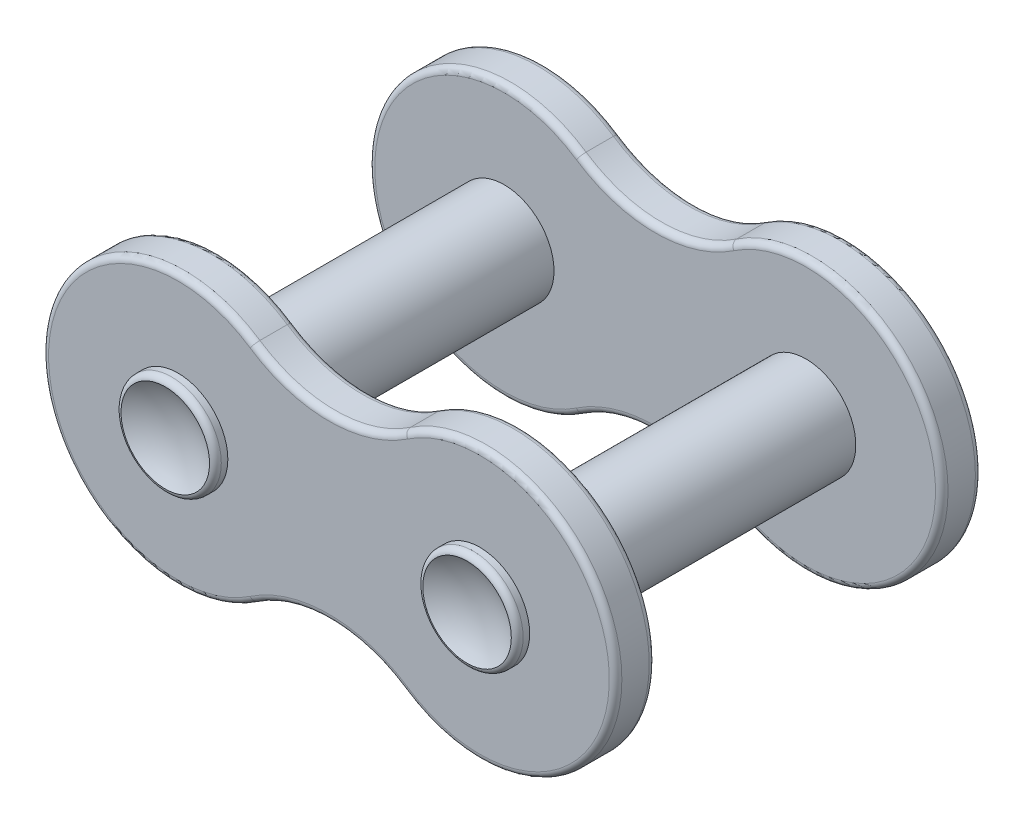
ISO-10303-21;
HEADER;
FILE_DESCRIPTION(('STEP AP214'),'2;1');
FILE_NAME('part.step','',(''),(''),'','','');
FILE_SCHEMA(('AUTOMOTIVE_DESIGN { 1 0 10303 214 1 1 1 1 }'));
ENDSEC;
DATA;
#1=APPLICATION_CONTEXT('core data for automotive mechanical design processes');
#2=APPLICATION_PROTOCOL_DEFINITION('international standard','automotive_design',2000,#1);
#3=PRODUCT_CONTEXT('',#1,'mechanical');
#4=PRODUCT('Part','Part','',(#3));
#5=PRODUCT_RELATED_PRODUCT_CATEGORY('part','',(#4));
#6=PRODUCT_DEFINITION_FORMATION('','',#4);
#7=PRODUCT_DEFINITION_CONTEXT('part definition',#1,'design');
#8=PRODUCT_DEFINITION('design','',#6,#7);
#9=PRODUCT_DEFINITION_SHAPE('','',#8);
#10=(LENGTH_UNIT() NAMED_UNIT(*) SI_UNIT(.MILLI.,.METRE.));
#11=(NAMED_UNIT(*) PLANE_ANGLE_UNIT() SI_UNIT($,.RADIAN.));
#12=(NAMED_UNIT(*) SI_UNIT($,.STERADIAN.) SOLID_ANGLE_UNIT());
#13=UNCERTAINTY_MEASURE_WITH_UNIT(LENGTH_MEASURE(1.E-05),#10,'distance_accuracy_value','');
#14=(GEOMETRIC_REPRESENTATION_CONTEXT(3) GLOBAL_UNCERTAINTY_ASSIGNED_CONTEXT((#13)) GLOBAL_UNIT_ASSIGNED_CONTEXT((#10,
#11,#12)) REPRESENTATION_CONTEXT('',''));
#15=CARTESIAN_POINT('',(0.,0.,0.));
#16=DIRECTION('',(0.,0.,1.));
#17=DIRECTION('',(1.,0.,0.));
#18=AXIS2_PLACEMENT_3D('',#15,#16,#17);
#19=CARTESIAN_POINT('',(3.,4.47214776638019,1.5875));
#20=DIRECTION('',(0.,0.,1.));
#21=DIRECTION('',(1.,0.,0.));
#22=AXIS2_PLACEMENT_3D('',#19,#20,#21);
#23=PLANE('',#22);
#24=CARTESIAN_POINT('',(0.,-8.94429553276038,1.5875));
#25=DIRECTION('',(0.,0.,1.));
#26=DIRECTION('',(1.,0.,0.));
#27=AXIS2_PLACEMENT_3D('',#24,#25,#26);
#28=CIRCLE('',#27,5.62284923191246);
#29=CARTESIAN_POINT('',(-3.13240496338893,-4.2747695792877,1.5875));
#30=VERTEX_POINT('',#29);
#31=CARTESIAN_POINT('',(3.13240496338893,-4.2747695792877,1.5875));
#32=VERTEX_POINT('',#31);
#33=EDGE_CURVE('E401',#30,#32,#28,.F.);
#34=ORIENTED_EDGE('',*,*,#33,.T.);
#35=CARTESIAN_POINT('',(6.,0.,1.5875));
#36=DIRECTION('',(0.,0.,1.));
#37=DIRECTION('',(1.,0.,0.));
#38=AXIS2_PLACEMENT_3D('',#35,#36,#37);
#39=CIRCLE('',#38,5.1475);
#40=CARTESIAN_POINT('',(3.13240496338893,4.2747695792877,1.5875));
#41=VERTEX_POINT('',#40);
#42=EDGE_CURVE('E403',#32,#41,#39,.T.);
#43=ORIENTED_EDGE('',*,*,#42,.T.);
#44=CARTESIAN_POINT('',(0.,8.94429553276038,1.5875));
#45=DIRECTION('',(0.,0.,1.));
#46=DIRECTION('',(1.,0.,0.));
#47=AXIS2_PLACEMENT_3D('',#44,#45,#46);
#48=CIRCLE('',#47,5.62284923191246);
#49=CARTESIAN_POINT('',(-3.13240496338893,4.2747695792877,1.5875));
#50=VERTEX_POINT('',#49);
#51=EDGE_CURVE('E184',#41,#50,#48,.F.);
#52=ORIENTED_EDGE('',*,*,#51,.T.);
#53=CARTESIAN_POINT('',(-6.,0.,1.5875));
#54=DIRECTION('',(0.,0.,1.));
#55=DIRECTION('',(1.,0.,0.));
#56=AXIS2_PLACEMENT_3D('',#53,#54,#55);
#57=CIRCLE('',#56,5.1475);
#58=EDGE_CURVE('E399',#50,#30,#57,.T.);
#59=ORIENTED_EDGE('',*,*,#58,.T.);
#60=EDGE_LOOP('',(#34,#43,#52,#59));
#61=FACE_BOUND('',#60,.T.);
#62=CARTESIAN_POINT('',(-6.,0.,1.5875));
#63=DIRECTION('',(0.,0.,1.));
#64=DIRECTION('',(1.,0.,0.));
#65=AXIS2_PLACEMENT_3D('',#62,#63,#64);
#66=CIRCLE('',#65,1.98);
#67=CARTESIAN_POINT('',(-4.02,0.,1.5875));
#68=VERTEX_POINT('',#67);
#69=EDGE_CURVE('E171',#68,#68,#66,.T.);
#70=ORIENTED_EDGE('',*,*,#69,.F.);
#71=EDGE_LOOP('',(#70));
#72=FACE_BOUND('',#71,.T.);
#73=CARTESIAN_POINT('',(6.,0.,1.5875));
#74=DIRECTION('',(0.,0.,1.));
#75=DIRECTION('',(-1.,0.,0.));
#76=AXIS2_PLACEMENT_3D('',#73,#74,#75);
#77=CIRCLE('',#76,1.98);
#78=CARTESIAN_POINT('',(4.02,0.,1.5875));
#79=VERTEX_POINT('',#78);
#80=EDGE_CURVE('E348',#79,#79,#77,.T.);
#81=ORIENTED_EDGE('',*,*,#80,.F.);
#82=EDGE_LOOP('',(#81));
#83=FACE_BOUND('',#82,.T.);
#84=ADVANCED_FACE('F33',(#61,#72,#83),#23,.T.);
#85=CARTESIAN_POINT('',(3.,4.47214776638019,0.));
#86=DIRECTION('',(0.,0.,1.));
#87=DIRECTION('',(1.,0.,0.));
#88=AXIS2_PLACEMENT_3D('',#85,#86,#87);
#89=PLANE('',#88);
#90=CARTESIAN_POINT('',(0.,8.94429553276038,0.));
#91=DIRECTION('',(0.,0.,1.));
#92=DIRECTION('',(1.,0.,0.));
#93=AXIS2_PLACEMENT_3D('',#90,#91,#92);
#94=CIRCLE('',#93,5.62284923191246);
#95=CARTESIAN_POINT('',(-3.13240496338893,4.2747695792877,0.));
#96=VERTEX_POINT('',#95);
#97=CARTESIAN_POINT('',(3.13240496338893,4.2747695792877,0.));
#98=VERTEX_POINT('',#97);
#99=EDGE_CURVE('E381',#96,#98,#94,.T.);
#100=ORIENTED_EDGE('',*,*,#99,.T.);
#101=CARTESIAN_POINT('',(6.,0.,0.));
#102=DIRECTION('',(0.,0.,1.));
#103=DIRECTION('',(1.,0.,0.));
#104=AXIS2_PLACEMENT_3D('',#101,#102,#103);
#105=CIRCLE('',#104,5.1475);
#106=CARTESIAN_POINT('',(3.13240496338893,-4.2747695792877,0.));
#107=VERTEX_POINT('',#106);
#108=EDGE_CURVE('E387',#98,#107,#105,.F.);
#109=ORIENTED_EDGE('',*,*,#108,.T.);
#110=CARTESIAN_POINT('',(0.,-8.94429553276038,0.));
#111=DIRECTION('',(0.,0.,1.));
#112=DIRECTION('',(1.,0.,0.));
#113=AXIS2_PLACEMENT_3D('',#110,#111,#112);
#114=CIRCLE('',#113,5.62284923191246);
#115=CARTESIAN_POINT('',(-3.13240496338893,-4.2747695792877,0.));
#116=VERTEX_POINT('',#115);
#117=EDGE_CURVE('E385',#107,#116,#114,.T.);
#118=ORIENTED_EDGE('',*,*,#117,.T.);
#119=CARTESIAN_POINT('',(-6.,0.,0.));
#120=DIRECTION('',(0.,0.,1.));
#121=DIRECTION('',(1.,0.,0.));
#122=AXIS2_PLACEMENT_3D('',#119,#120,#121);
#123=CIRCLE('',#122,5.1475);
#124=EDGE_CURVE('E383',#116,#96,#123,.F.);
#125=ORIENTED_EDGE('',*,*,#124,.T.);
#126=EDGE_LOOP('',(#100,#109,#118,#125));
#127=FACE_BOUND('',#126,.T.);
#128=CARTESIAN_POINT('',(-6.,0.,0.));
#129=DIRECTION('',(0.,0.,1.));
#130=DIRECTION('',(1.,0.,0.));
#131=AXIS2_PLACEMENT_3D('',#128,#129,#130);
#132=CIRCLE('',#131,1.98);
#133=CARTESIAN_POINT('',(-4.02,0.,0.));
#134=VERTEX_POINT('',#133);
#135=EDGE_CURVE('E346',#134,#134,#132,.T.);
#136=ORIENTED_EDGE('',*,*,#135,.T.);
#137=EDGE_LOOP('',(#136));
#138=FACE_BOUND('',#137,.T.);
#139=CARTESIAN_POINT('',(6.,0.,0.));
#140=DIRECTION('',(0.,0.,1.));
#141=DIRECTION('',(1.,0.,0.));
#142=AXIS2_PLACEMENT_3D('',#139,#140,#141);
#143=CIRCLE('',#142,1.98);
#144=CARTESIAN_POINT('',(7.98,0.,0.));
#145=VERTEX_POINT('',#144);
#146=EDGE_CURVE('E372',#145,#145,#143,.F.);
#147=ORIENTED_EDGE('',*,*,#146,.F.);
#148=EDGE_LOOP('',(#147));
#149=FACE_BOUND('',#148,.T.);
#150=ADVANCED_FACE('F244',(#127,#138,#149),#89,.F.);
#151=CARTESIAN_POINT('',(0.,8.94429553276038,1.5875));
#152=DIRECTION('',(0.,0.,-1.));
#153=DIRECTION('',(-1.,0.,0.));
#154=AXIS2_PLACEMENT_3D('',#151,#152,#153);
#155=CYLINDRICAL_SURFACE('',#154,5.37284923191246);
#156=DIRECTION('',(0.,0.,-1.));
#157=VECTOR('',#156,1.);
#158=CARTESIAN_POINT('',(2.99313371343211,4.48238344909284,1.5875));
#159=LINE('',#158,#157);
#160=CARTESIAN_POINT('',(2.99313371343211,4.48238344909284,1.3375));
#161=VERTEX_POINT('',#160);
#162=CARTESIAN_POINT('',(2.99313371343211,4.48238344909284,0.25));
#163=VERTEX_POINT('',#162);
#164=EDGE_CURVE('E150',#161,#163,#159,.T.);
#165=ORIENTED_EDGE('',*,*,#164,.T.);
#166=CARTESIAN_POINT('',(0.,8.94429553276038,0.25));
#167=DIRECTION('',(0.,0.,1.));
#168=DIRECTION('',(1.,0.,0.));
#169=AXIS2_PLACEMENT_3D('',#166,#167,#168);
#170=CIRCLE('',#169,5.37284923191246);
#171=CARTESIAN_POINT('',(-2.9931337134321,4.48238344909284,0.25));
#172=VERTEX_POINT('',#171);
#173=EDGE_CURVE('E157',#163,#172,#170,.F.);
#174=ORIENTED_EDGE('',*,*,#173,.T.);
#175=DIRECTION('',(0.,0.,-1.));
#176=VECTOR('',#175,1.);
#177=CARTESIAN_POINT('',(-2.9931337134321,4.48238344909284,1.5875));
#178=LINE('',#177,#176);
#179=CARTESIAN_POINT('',(-2.9931337134321,4.48238344909284,1.3375));
#180=VERTEX_POINT('',#179);
#181=EDGE_CURVE('E152',#180,#172,#178,.T.);
#182=ORIENTED_EDGE('',*,*,#181,.F.);
#183=CARTESIAN_POINT('',(0.,8.94429553276038,1.3375));
#184=DIRECTION('',(0.,0.,1.));
#185=DIRECTION('',(1.,0.,0.));
#186=AXIS2_PLACEMENT_3D('',#183,#184,#185);
#187=CIRCLE('',#186,5.37284923191246);
#188=EDGE_CURVE('E147',#180,#161,#187,.T.);
#189=ORIENTED_EDGE('',*,*,#188,.T.);
#190=EDGE_LOOP('',(#165,#174,#182,#189));
#191=FACE_BOUND('',#190,.T.);
#192=ADVANCED_FACE('F149',(#191),#155,.F.);
#193=CARTESIAN_POINT('',(-6.,0.,1.5875));
#194=DIRECTION('',(0.,0.,-1.));
#195=DIRECTION('',(-1.,0.,0.));
#196=AXIS2_PLACEMENT_3D('',#193,#194,#195);
#197=CYLINDRICAL_SURFACE('',#196,5.3975);
#198=ORIENTED_EDGE('',*,*,#181,.T.);
#199=CARTESIAN_POINT('',(-6.,0.,0.25));
#200=DIRECTION('',(0.,0.,1.));
#201=DIRECTION('',(1.,0.,0.));
#202=AXIS2_PLACEMENT_3D('',#199,#200,#201);
#203=CIRCLE('',#202,5.3975);
#204=CARTESIAN_POINT('',(-2.99313371343211,-4.48238344909284,0.25));
#205=VERTEX_POINT('',#204);
#206=EDGE_CURVE('E396',#172,#205,#203,.T.);
#207=ORIENTED_EDGE('',*,*,#206,.T.);
#208=DIRECTION('',(0.,0.,-1.));
#209=VECTOR('',#208,1.);
#210=CARTESIAN_POINT('',(-2.99313371343211,-4.48238344909284,1.5875));
#211=LINE('',#210,#209);
#212=CARTESIAN_POINT('',(-2.99313371343211,-4.48238344909284,1.3375));
#213=VERTEX_POINT('',#212);
#214=EDGE_CURVE('E361',#213,#205,#211,.T.);
#215=ORIENTED_EDGE('',*,*,#214,.F.);
#216=CARTESIAN_POINT('',(-6.,0.,1.3375));
#217=DIRECTION('',(0.,0.,1.));
#218=DIRECTION('',(1.,0.,0.));
#219=AXIS2_PLACEMENT_3D('',#216,#217,#218);
#220=CIRCLE('',#219,5.3975);
#221=EDGE_CURVE('E394',#213,#180,#220,.F.);
#222=ORIENTED_EDGE('',*,*,#221,.T.);
#223=EDGE_LOOP('',(#198,#207,#215,#222));
#224=FACE_BOUND('',#223,.T.);
#225=ADVANCED_FACE('F263',(#224),#197,.T.);
#226=CARTESIAN_POINT('',(0.,-8.94429553276038,1.5875));
#227=DIRECTION('',(0.,0.,-1.));
#228=DIRECTION('',(-1.,0.,0.));
#229=AXIS2_PLACEMENT_3D('',#226,#227,#228);
#230=CYLINDRICAL_SURFACE('',#229,5.37284923191246);
#231=ORIENTED_EDGE('',*,*,#214,.T.);
#232=CARTESIAN_POINT('',(0.,-8.94429553276038,0.25));
#233=DIRECTION('',(0.,0.,1.));
#234=DIRECTION('',(1.,0.,0.));
#235=AXIS2_PLACEMENT_3D('',#232,#233,#234);
#236=CIRCLE('',#235,5.37284923191246);
#237=CARTESIAN_POINT('',(2.99313371343211,-4.48238344909284,0.25));
#238=VERTEX_POINT('',#237);
#239=EDGE_CURVE('E392',#205,#238,#236,.F.);
#240=ORIENTED_EDGE('',*,*,#239,.T.);
#241=DIRECTION('',(0.,0.,-1.));
#242=VECTOR('',#241,1.);
#243=CARTESIAN_POINT('',(2.99313371343211,-4.48238344909284,1.5875));
#244=LINE('',#243,#242);
#245=CARTESIAN_POINT('',(2.99313371343211,-4.48238344909284,1.3375));
#246=VERTEX_POINT('',#245);
#247=EDGE_CURVE('E170',#246,#238,#244,.T.);
#248=ORIENTED_EDGE('',*,*,#247,.F.);
#249=CARTESIAN_POINT('',(0.,-8.94429553276038,1.3375));
#250=DIRECTION('',(0.,0.,1.));
#251=DIRECTION('',(1.,0.,0.));
#252=AXIS2_PLACEMENT_3D('',#249,#250,#251);
#253=CIRCLE('',#252,5.37284923191246);
#254=EDGE_CURVE('E390',#246,#213,#253,.T.);
#255=ORIENTED_EDGE('',*,*,#254,.T.);
#256=EDGE_LOOP('',(#231,#240,#248,#255));
#257=FACE_BOUND('',#256,.T.);
#258=ADVANCED_FACE('F260',(#257),#230,.F.);
#259=CARTESIAN_POINT('',(6.,0.,1.5875));
#260=DIRECTION('',(0.,0.,-1.));
#261=DIRECTION('',(-1.,0.,0.));
#262=AXIS2_PLACEMENT_3D('',#259,#260,#261);
#263=CYLINDRICAL_SURFACE('',#262,5.3975);
#264=ORIENTED_EDGE('',*,*,#247,.T.);
#265=CARTESIAN_POINT('',(6.,0.,0.25));
#266=DIRECTION('',(0.,0.,1.));
#267=DIRECTION('',(1.,0.,0.));
#268=AXIS2_PLACEMENT_3D('',#265,#266,#267);
#269=CIRCLE('',#268,5.3975);
#270=EDGE_CURVE('E169',#238,#163,#269,.T.);
#271=ORIENTED_EDGE('',*,*,#270,.T.);
#272=ORIENTED_EDGE('',*,*,#164,.F.);
#273=CARTESIAN_POINT('',(6.,0.,1.3375));
#274=DIRECTION('',(0.,0.,1.));
#275=DIRECTION('',(1.,0.,0.));
#276=AXIS2_PLACEMENT_3D('',#273,#274,#275);
#277=CIRCLE('',#276,5.3975);
#278=EDGE_CURVE('E166',#161,#246,#277,.F.);
#279=ORIENTED_EDGE('',*,*,#278,.T.);
#280=EDGE_LOOP('',(#264,#271,#272,#279));
#281=FACE_BOUND('',#280,.T.);
#282=ADVANCED_FACE('F165',(#281),#263,.T.);
#283=CARTESIAN_POINT('',(-6.,0.,-0.508));
#284=DIRECTION('',(0.,0.,1.));
#285=DIRECTION('',(1.,0.,0.));
#286=AXIS2_PLACEMENT_3D('',#283,#284,#285);
#287=CYLINDRICAL_SURFACE('',#286,1.98);
#288=CARTESIAN_POINT('',(-6.,0.,-0.259778069270001));
#289=DIRECTION('',(0.,0.,-1.));
#290=DIRECTION('',(-1.,0.,0.));
#291=AXIS2_PLACEMENT_3D('',#288,#289,#290);
#292=CIRCLE('',#291,1.98);
#293=CARTESIAN_POINT('',(-7.98,0.,-0.259778069270001));
#294=VERTEX_POINT('',#293);
#295=EDGE_CURVE('E218',#294,#294,#292,.F.);
#296=ORIENTED_EDGE('',*,*,#295,.T.);
#297=EDGE_LOOP('',(#296));
#298=FACE_BOUND('',#297,.T.);
#299=ORIENTED_EDGE('',*,*,#135,.F.);
#300=EDGE_LOOP('',(#299));
#301=FACE_BOUND('',#300,.T.);
#302=ADVANCED_FACE('F259',(#298,#301),#287,.T.);
#303=CARTESIAN_POINT('',(-6.,0.,12.969748));
#304=DIRECTION('',(0.,0.,-1.));
#305=DIRECTION('',(-1.,0.,0.));
#306=AXIS2_PLACEMENT_3D('',#303,#304,#305);
#307=CIRCLE('',#306,1.98);
#308=CARTESIAN_POINT('',(-7.98,0.,12.969748));
#309=VERTEX_POINT('',#308);
#310=EDGE_CURVE('E181',#309,#309,#307,.F.);
#311=ORIENTED_EDGE('',*,*,#310,.F.);
#312=EDGE_LOOP('',(#311));
#313=FACE_BOUND('',#312,.T.);
#314=ORIENTED_EDGE('',*,*,#69,.T.);
#315=EDGE_LOOP('',(#314));
#316=FACE_BOUND('',#315,.T.);
#317=ADVANCED_FACE('F254',(#313,#316),#287,.T.);
#318=CARTESIAN_POINT('',(0.,8.94429553276038,12.969748));
#319=DIRECTION('',(0.,0.,1.));
#320=DIRECTION('',(1.,0.,0.));
#321=AXIS2_PLACEMENT_3D('',#318,#319,#320);
#322=CYLINDRICAL_SURFACE('',#321,5.37284923191246);
#323=DIRECTION('',(0.,0.,1.));
#324=VECTOR('',#323,1.);
#325=CARTESIAN_POINT('',(2.99313371343211,4.48238344909284,12.969748));
#326=LINE('',#325,#324);
#327=CARTESIAN_POINT('',(2.99313371343211,4.48238344909284,13.219748));
#328=VERTEX_POINT('',#327);
#329=CARTESIAN_POINT('',(2.99313371343211,4.48238344909284,14.307248));
#330=VERTEX_POINT('',#329);
#331=EDGE_CURVE('E349',#328,#330,#326,.T.);
#332=ORIENTED_EDGE('',*,*,#331,.F.);
#333=CARTESIAN_POINT('',(0.,8.94429553276038,13.219748));
#334=DIRECTION('',(0.,0.,-1.));
#335=DIRECTION('',(-1.,0.,0.));
#336=AXIS2_PLACEMENT_3D('',#333,#334,#335);
#337=CIRCLE('',#336,5.37284923191246);
#338=CARTESIAN_POINT('',(-2.9931337134321,4.48238344909284,13.219748));
#339=VERTEX_POINT('',#338);
#340=EDGE_CURVE('E222',#328,#339,#337,.T.);
#341=ORIENTED_EDGE('',*,*,#340,.T.);
#342=DIRECTION('',(0.,0.,1.));
#343=VECTOR('',#342,1.);
#344=CARTESIAN_POINT('',(-2.9931337134321,4.48238344909284,12.969748));
#345=LINE('',#344,#343);
#346=CARTESIAN_POINT('',(-2.9931337134321,4.48238344909284,14.307248));
#347=VERTEX_POINT('',#346);
#348=EDGE_CURVE('E471',#339,#347,#345,.T.);
#349=ORIENTED_EDGE('',*,*,#348,.T.);
#350=CARTESIAN_POINT('',(0.,8.94429553276038,14.307248));
#351=DIRECTION('',(0.,0.,-1.));
#352=DIRECTION('',(-1.,0.,0.));
#353=AXIS2_PLACEMENT_3D('',#350,#351,#352);
#354=CIRCLE('',#353,5.37284923191246);
#355=EDGE_CURVE('E434',#347,#330,#354,.F.);
#356=ORIENTED_EDGE('',*,*,#355,.T.);
#357=EDGE_LOOP('',(#332,#341,#349,#356));
#358=FACE_BOUND('',#357,.T.);
#359=ADVANCED_FACE('F497',(#358),#322,.F.);
#360=CARTESIAN_POINT('',(6.,0.,12.969748));
#361=DIRECTION('',(0.,0.,1.));
#362=DIRECTION('',(1.,0.,0.));
#363=AXIS2_PLACEMENT_3D('',#360,#361,#362);
#364=CYLINDRICAL_SURFACE('',#363,5.3975);
#365=DIRECTION('',(0.,0.,1.));
#366=VECTOR('',#365,1.);
#367=CARTESIAN_POINT('',(2.99313371343211,-4.48238344909284,12.969748));
#368=LINE('',#367,#366);
#369=CARTESIAN_POINT('',(2.99313371343211,-4.48238344909284,13.219748));
#370=VERTEX_POINT('',#369);
#371=CARTESIAN_POINT('',(2.99313371343211,-4.48238344909284,14.307248));
#372=VERTEX_POINT('',#371);
#373=EDGE_CURVE('E354',#370,#372,#368,.T.);
#374=ORIENTED_EDGE('',*,*,#373,.F.);
#375=CARTESIAN_POINT('',(6.,0.,13.219748));
#376=DIRECTION('',(0.,0.,-1.));
#377=DIRECTION('',(-1.,0.,0.));
#378=AXIS2_PLACEMENT_3D('',#375,#376,#377);
#379=CIRCLE('',#378,5.3975);
#380=EDGE_CURVE('E408',#370,#328,#379,.F.);
#381=ORIENTED_EDGE('',*,*,#380,.T.);
#382=ORIENTED_EDGE('',*,*,#331,.T.);
#383=CARTESIAN_POINT('',(6.,0.,14.307248));
#384=DIRECTION('',(0.,0.,-1.));
#385=DIRECTION('',(-1.,0.,0.));
#386=AXIS2_PLACEMENT_3D('',#383,#384,#385);
#387=CIRCLE('',#386,5.3975);
#388=EDGE_CURVE('E405',#330,#372,#387,.T.);
#389=ORIENTED_EDGE('',*,*,#388,.T.);
#390=EDGE_LOOP('',(#374,#381,#382,#389));
#391=FACE_BOUND('',#390,.T.);
#392=ADVANCED_FACE('F485',(#391),#364,.T.);
#393=CARTESIAN_POINT('',(0.,-8.94429553276038,12.969748));
#394=DIRECTION('',(0.,0.,1.));
#395=DIRECTION('',(1.,0.,0.));
#396=AXIS2_PLACEMENT_3D('',#393,#394,#395);
#397=CYLINDRICAL_SURFACE('',#396,5.37284923191246);
#398=DIRECTION('',(0.,0.,1.));
#399=VECTOR('',#398,1.);
#400=CARTESIAN_POINT('',(-2.99313371343211,-4.48238344909284,12.969748));
#401=LINE('',#400,#399);
#402=CARTESIAN_POINT('',(-2.99313371343211,-4.48238344909284,13.219748));
#403=VERTEX_POINT('',#402);
#404=CARTESIAN_POINT('',(-2.99313371343211,-4.48238344909284,14.307248));
#405=VERTEX_POINT('',#404);
#406=EDGE_CURVE('E474',#403,#405,#401,.T.);
#407=ORIENTED_EDGE('',*,*,#406,.F.);
#408=CARTESIAN_POINT('',(0.,-8.94429553276038,13.219748));
#409=DIRECTION('',(0.,0.,-1.));
#410=DIRECTION('',(-1.,0.,0.));
#411=AXIS2_PLACEMENT_3D('',#408,#409,#410);
#412=CIRCLE('',#411,5.37284923191246);
#413=EDGE_CURVE('E422',#403,#370,#412,.T.);
#414=ORIENTED_EDGE('',*,*,#413,.T.);
#415=ORIENTED_EDGE('',*,*,#373,.T.);
#416=CARTESIAN_POINT('',(0.,-8.94429553276038,14.307248));
#417=DIRECTION('',(0.,0.,-1.));
#418=DIRECTION('',(-1.,0.,0.));
#419=AXIS2_PLACEMENT_3D('',#416,#417,#418);
#420=CIRCLE('',#419,5.37284923191246);
#421=EDGE_CURVE('E420',#372,#405,#420,.F.);
#422=ORIENTED_EDGE('',*,*,#421,.T.);
#423=EDGE_LOOP('',(#407,#414,#415,#422));
#424=FACE_BOUND('',#423,.T.);
#425=ADVANCED_FACE('F480',(#424),#397,.F.);
#426=CARTESIAN_POINT('',(-6.,0.,12.969748));
#427=DIRECTION('',(0.,0.,1.));
#428=DIRECTION('',(1.,0.,0.));
#429=AXIS2_PLACEMENT_3D('',#426,#427,#428);
#430=CYLINDRICAL_SURFACE('',#429,5.3975);
#431=ORIENTED_EDGE('',*,*,#348,.F.);
#432=CARTESIAN_POINT('',(-6.,0.,13.219748));
#433=DIRECTION('',(0.,0.,-1.));
#434=DIRECTION('',(-1.,0.,0.));
#435=AXIS2_PLACEMENT_3D('',#432,#433,#434);
#436=CIRCLE('',#435,5.3975);
#437=EDGE_CURVE('E426',#339,#403,#436,.F.);
#438=ORIENTED_EDGE('',*,*,#437,.T.);
#439=ORIENTED_EDGE('',*,*,#406,.T.);
#440=CARTESIAN_POINT('',(-6.,0.,14.307248));
#441=DIRECTION('',(0.,0.,-1.));
#442=DIRECTION('',(-1.,0.,0.));
#443=AXIS2_PLACEMENT_3D('',#440,#441,#442);
#444=CIRCLE('',#443,5.3975);
#445=EDGE_CURVE('E424',#405,#347,#444,.T.);
#446=ORIENTED_EDGE('',*,*,#445,.T.);
#447=EDGE_LOOP('',(#431,#438,#439,#446));
#448=FACE_BOUND('',#447,.T.);
#449=ADVANCED_FACE('F501',(#448),#430,.T.);
#450=CARTESIAN_POINT('',(3.,4.47214776638019,12.969748));
#451=DIRECTION('',(0.,0.,-1.));
#452=DIRECTION('',(1.,0.,0.));
#453=AXIS2_PLACEMENT_3D('',#450,#451,#452);
#454=PLANE('',#453);
#455=CARTESIAN_POINT('',(0.,8.94429553276038,12.969748));
#456=DIRECTION('',(0.,0.,-1.));
#457=DIRECTION('',(-1.,0.,0.));
#458=AXIS2_PLACEMENT_3D('',#455,#456,#457);
#459=CIRCLE('',#458,5.62284923191246);
#460=CARTESIAN_POINT('',(-3.13240496338893,4.2747695792877,12.969748));
#461=VERTEX_POINT('',#460);
#462=CARTESIAN_POINT('',(3.13240496338893,4.2747695792877,12.969748));
#463=VERTEX_POINT('',#462);
#464=EDGE_CURVE('E411',#461,#463,#459,.F.);
#465=ORIENTED_EDGE('',*,*,#464,.T.);
#466=CARTESIAN_POINT('',(6.,0.,12.969748));
#467=DIRECTION('',(0.,0.,-1.));
#468=DIRECTION('',(-1.,0.,0.));
#469=AXIS2_PLACEMENT_3D('',#466,#467,#468);
#470=CIRCLE('',#469,5.1475);
#471=CARTESIAN_POINT('',(3.13240496338893,-4.2747695792877,12.969748));
#472=VERTEX_POINT('',#471);
#473=EDGE_CURVE('E417',#463,#472,#470,.T.);
#474=ORIENTED_EDGE('',*,*,#473,.T.);
#475=CARTESIAN_POINT('',(0.,-8.94429553276038,12.969748));
#476=DIRECTION('',(0.,0.,-1.));
#477=DIRECTION('',(-1.,0.,0.));
#478=AXIS2_PLACEMENT_3D('',#475,#476,#477);
#479=CIRCLE('',#478,5.62284923191246);
#480=CARTESIAN_POINT('',(-3.13240496338893,-4.2747695792877,12.969748));
#481=VERTEX_POINT('',#480);
#482=EDGE_CURVE('E415',#472,#481,#479,.F.);
#483=ORIENTED_EDGE('',*,*,#482,.T.);
#484=CARTESIAN_POINT('',(-6.,0.,12.969748));
#485=DIRECTION('',(0.,0.,-1.));
#486=DIRECTION('',(-1.,0.,0.));
#487=AXIS2_PLACEMENT_3D('',#484,#485,#486);
#488=CIRCLE('',#487,5.1475);
#489=EDGE_CURVE('E413',#481,#461,#488,.T.);
#490=ORIENTED_EDGE('',*,*,#489,.T.);
#491=EDGE_LOOP('',(#465,#474,#483,#490));
#492=FACE_BOUND('',#491,.T.);
#493=CARTESIAN_POINT('',(6.,0.,12.969748));
#494=DIRECTION('',(0.,0.,-1.));
#495=DIRECTION('',(-1.,0.,0.));
#496=AXIS2_PLACEMENT_3D('',#493,#494,#495);
#497=CIRCLE('',#496,1.98);
#498=CARTESIAN_POINT('',(4.02,0.,12.969748));
#499=VERTEX_POINT('',#498);
#500=EDGE_CURVE('E376',#499,#499,#497,.F.);
#501=ORIENTED_EDGE('',*,*,#500,.T.);
#502=EDGE_LOOP('',(#501));
#503=FACE_BOUND('',#502,.T.);
#504=ORIENTED_EDGE('',*,*,#310,.T.);
#505=EDGE_LOOP('',(#504));
#506=FACE_BOUND('',#505,.T.);
#507=ADVANCED_FACE('F506',(#492,#503,#506),#454,.T.);
#508=CARTESIAN_POINT('',(3.,4.47214776638019,14.557248));
#509=DIRECTION('',(0.,0.,-1.));
#510=DIRECTION('',(1.,0.,0.));
#511=AXIS2_PLACEMENT_3D('',#508,#509,#510);
#512=PLANE('',#511);
#513=CARTESIAN_POINT('',(0.,-8.94429553276038,14.557248));
#514=DIRECTION('',(0.,0.,-1.));
#515=DIRECTION('',(-1.,0.,0.));
#516=AXIS2_PLACEMENT_3D('',#513,#514,#515);
#517=CIRCLE('',#516,5.62284923191246);
#518=CARTESIAN_POINT('',(-3.13240496338893,-4.2747695792877,14.557248));
#519=VERTEX_POINT('',#518);
#520=CARTESIAN_POINT('',(3.13240496338893,-4.2747695792877,14.557248));
#521=VERTEX_POINT('',#520);
#522=EDGE_CURVE('E48',#519,#521,#517,.T.);
#523=ORIENTED_EDGE('',*,*,#522,.T.);
#524=CARTESIAN_POINT('',(6.,0.,14.557248));
#525=DIRECTION('',(0.,0.,-1.));
#526=DIRECTION('',(-1.,0.,0.));
#527=AXIS2_PLACEMENT_3D('',#524,#525,#526);
#528=CIRCLE('',#527,5.1475);
#529=CARTESIAN_POINT('',(3.13240496338893,4.2747695792877,14.557248));
#530=VERTEX_POINT('',#529);
#531=EDGE_CURVE('E158',#521,#530,#528,.F.);
#532=ORIENTED_EDGE('',*,*,#531,.T.);
#533=CARTESIAN_POINT('',(0.,8.94429553276038,14.557248));
#534=DIRECTION('',(0.,0.,-1.));
#535=DIRECTION('',(-1.,0.,0.));
#536=AXIS2_PLACEMENT_3D('',#533,#534,#535);
#537=CIRCLE('',#536,5.62284923191246);
#538=CARTESIAN_POINT('',(-3.13240496338893,4.2747695792877,14.557248));
#539=VERTEX_POINT('',#538);
#540=EDGE_CURVE('E428',#530,#539,#537,.T.);
#541=ORIENTED_EDGE('',*,*,#540,.T.);
#542=CARTESIAN_POINT('',(-6.,0.,14.557248));
#543=DIRECTION('',(0.,0.,-1.));
#544=DIRECTION('',(-1.,0.,0.));
#545=AXIS2_PLACEMENT_3D('',#542,#543,#544);
#546=CIRCLE('',#545,5.1475);
#547=EDGE_CURVE('E53',#539,#519,#546,.F.);
#548=ORIENTED_EDGE('',*,*,#547,.T.);
#549=EDGE_LOOP('',(#523,#532,#541,#548));
#550=FACE_BOUND('',#549,.T.);
#551=CARTESIAN_POINT('',(6.,0.,14.557248));
#552=DIRECTION('',(0.,0.,1.));
#553=DIRECTION('',(-1.,0.,0.));
#554=AXIS2_PLACEMENT_3D('',#551,#552,#553);
#555=CIRCLE('',#554,1.98);
#556=CARTESIAN_POINT('',(4.02,0.,14.557248));
#557=VERTEX_POINT('',#556);
#558=EDGE_CURVE('E370',#557,#557,#555,.T.);
#559=ORIENTED_EDGE('',*,*,#558,.F.);
#560=EDGE_LOOP('',(#559));
#561=FACE_BOUND('',#560,.T.);
#562=CARTESIAN_POINT('',(-6.,0.,14.557248));
#563=DIRECTION('',(0.,0.,1.));
#564=DIRECTION('',(1.,0.,0.));
#565=AXIS2_PLACEMENT_3D('',#562,#563,#564);
#566=CIRCLE('',#565,1.98);
#567=CARTESIAN_POINT('',(-4.02,0.,14.557248));
#568=VERTEX_POINT('',#567);
#569=EDGE_CURVE('E468',#568,#568,#566,.T.);
#570=ORIENTED_EDGE('',*,*,#569,.F.);
#571=EDGE_LOOP('',(#570));
#572=FACE_BOUND('',#571,.T.);
#573=ADVANCED_FACE('F509',(#550,#561,#572),#512,.F.);
#574=CARTESIAN_POINT('',(-6.,0.,14.81702606927));
#575=DIRECTION('',(0.,0.,1.));
#576=DIRECTION('',(1.,0.,0.));
#577=AXIS2_PLACEMENT_3D('',#574,#575,#576);
#578=CIRCLE('',#577,1.98);
#579=CARTESIAN_POINT('',(-4.02,0.,14.81702606927));
#580=VERTEX_POINT('',#579);
#581=EDGE_CURVE('E11',#580,#580,#578,.F.);
#582=ORIENTED_EDGE('',*,*,#581,.T.);
#583=EDGE_LOOP('',(#582));
#584=FACE_BOUND('',#583,.T.);
#585=ORIENTED_EDGE('',*,*,#569,.T.);
#586=EDGE_LOOP('',(#585));
#587=FACE_BOUND('',#586,.T.);
#588=ADVANCED_FACE('F343',(#584,#587),#287,.T.);
#589=CARTESIAN_POINT('',(-6.,0.,17.859248));
#590=DIRECTION('',(0.,0.,-1.));
#591=DIRECTION('',(1.,0.,0.));
#592=AXIS2_PLACEMENT_3D('',#589,#590,#591);
#593=SPHERICAL_SURFACE('',#592,3.302);
#594=CARTESIAN_POINT('',(-6.,0.,15.065248));
#595=DIRECTION('',(0.,0.,1.));
#596=DIRECTION('',(1.,0.,0.));
#597=AXIS2_PLACEMENT_3D('',#594,#595,#596);
#598=CIRCLE('',#597,1.75976362048998);
#599=CARTESIAN_POINT('',(-4.24023637951002,0.,15.065248));
#600=VERTEX_POINT('',#599);
#601=EDGE_CURVE('E367',#600,#600,#598,.T.);
#602=ORIENTED_EDGE('',*,*,#601,.T.);
#603=EDGE_LOOP('',(#602));
#604=FACE_BOUND('',#603,.T.);
#605=ADVANCED_FACE('F538',(#604),#593,.F.);
#606=CARTESIAN_POINT('',(-6.,0.,-3.302));
#607=DIRECTION('',(0.,0.,1.));
#608=DIRECTION('',(1.,0.,0.));
#609=AXIS2_PLACEMENT_3D('',#606,#607,#608);
#610=SPHERICAL_SURFACE('',#609,3.302);
#611=CARTESIAN_POINT('',(-6.,0.,-0.508));
#612=DIRECTION('',(0.,0.,1.));
#613=DIRECTION('',(1.,0.,0.));
#614=AXIS2_PLACEMENT_3D('',#611,#612,#613);
#615=CIRCLE('',#614,1.75976362048998);
#616=CARTESIAN_POINT('',(-4.24023637951002,0.,-0.508));
#617=VERTEX_POINT('',#616);
#618=EDGE_CURVE('E338',#617,#617,#615,.T.);
#619=ORIENTED_EDGE('',*,*,#618,.F.);
#620=EDGE_LOOP('',(#619));
#621=FACE_BOUND('',#620,.T.);
#622=ADVANCED_FACE('F532',(#621),#610,.F.);
#623=CARTESIAN_POINT('',(6.,0.,-0.508));
#624=DIRECTION('',(0.,0.,1.));
#625=DIRECTION('',(1.,0.,0.));
#626=AXIS2_PLACEMENT_3D('',#623,#624,#625);
#627=CYLINDRICAL_SURFACE('',#626,1.98);
#628=CARTESIAN_POINT('',(6.,0.,14.81702606927));
#629=DIRECTION('',(0.,0.,1.));
#630=DIRECTION('',(1.,0.,0.));
#631=AXIS2_PLACEMENT_3D('',#628,#629,#630);
#632=CIRCLE('',#631,1.98);
#633=CARTESIAN_POINT('',(7.98,0.,14.81702606927));
#634=VERTEX_POINT('',#633);
#635=EDGE_CURVE('E41',#634,#634,#632,.F.);
#636=ORIENTED_EDGE('',*,*,#635,.T.);
#637=EDGE_LOOP('',(#636));
#638=FACE_BOUND('',#637,.T.);
#639=ORIENTED_EDGE('',*,*,#558,.T.);
#640=EDGE_LOOP('',(#639));
#641=FACE_BOUND('',#640,.T.);
#642=ADVANCED_FACE('F227',(#638,#641),#627,.T.);
#643=ORIENTED_EDGE('',*,*,#80,.T.);
#644=EDGE_LOOP('',(#643));
#645=FACE_BOUND('',#644,.T.);
#646=ORIENTED_EDGE('',*,*,#500,.F.);
#647=EDGE_LOOP('',(#646));
#648=FACE_BOUND('',#647,.T.);
#649=ADVANCED_FACE('F521',(#645,#648),#627,.T.);
#650=CARTESIAN_POINT('',(6.,0.,-0.259778069270001));
#651=DIRECTION('',(0.,0.,-1.));
#652=DIRECTION('',(-1.,0.,0.));
#653=AXIS2_PLACEMENT_3D('',#650,#651,#652);
#654=CIRCLE('',#653,1.98);
#655=CARTESIAN_POINT('',(4.02,0.,-0.259778069270001));
#656=VERTEX_POINT('',#655);
#657=EDGE_CURVE('E221',#656,#656,#654,.F.);
#658=ORIENTED_EDGE('',*,*,#657,.T.);
#659=EDGE_LOOP('',(#658));
#660=FACE_BOUND('',#659,.T.);
#661=ORIENTED_EDGE('',*,*,#146,.T.);
#662=EDGE_LOOP('',(#661));
#663=FACE_BOUND('',#662,.T.);
#664=ADVANCED_FACE('F524',(#660,#663),#627,.T.);
#665=CARTESIAN_POINT('',(6.,0.,-3.302));
#666=DIRECTION('',(0.,0.,1.));
#667=DIRECTION('',(-1.,0.,0.));
#668=AXIS2_PLACEMENT_3D('',#665,#666,#667);
#669=SPHERICAL_SURFACE('',#668,3.302);
#670=CARTESIAN_POINT('',(6.,0.,-0.508));
#671=DIRECTION('',(0.,0.,1.));
#672=DIRECTION('',(1.,0.,0.));
#673=AXIS2_PLACEMENT_3D('',#670,#671,#672);
#674=CIRCLE('',#673,1.75976362048998);
#675=CARTESIAN_POINT('',(7.75976362048998,0.,-0.508));
#676=VERTEX_POINT('',#675);
#677=EDGE_CURVE('E373',#676,#676,#674,.T.);
#678=ORIENTED_EDGE('',*,*,#677,.F.);
#679=EDGE_LOOP('',(#678));
#680=FACE_BOUND('',#679,.T.);
#681=ADVANCED_FACE('F530',(#680),#669,.F.);
#682=CARTESIAN_POINT('',(6.,0.,17.859248));
#683=DIRECTION('',(0.,0.,-1.));
#684=DIRECTION('',(-1.,0.,0.));
#685=AXIS2_PLACEMENT_3D('',#682,#683,#684);
#686=SPHERICAL_SURFACE('',#685,3.302);
#687=CARTESIAN_POINT('',(6.,0.,15.065248));
#688=DIRECTION('',(0.,0.,1.));
#689=DIRECTION('',(1.,0.,0.));
#690=AXIS2_PLACEMENT_3D('',#687,#688,#689);
#691=CIRCLE('',#690,1.75976362048998);
#692=CARTESIAN_POINT('',(7.75976362048998,0.,15.065248));
#693=VERTEX_POINT('',#692);
#694=EDGE_CURVE('E377',#693,#693,#691,.T.);
#695=ORIENTED_EDGE('',*,*,#694,.T.);
#696=EDGE_LOOP('',(#695));
#697=FACE_BOUND('',#696,.T.);
#698=ADVANCED_FACE('F286',(#697),#686,.F.);
#699=CARTESIAN_POINT('',(-6.,0.,0.25));
#700=DIRECTION('',(0.,0.,1.));
#701=DIRECTION('',(1.,0.,0.));
#702=AXIS2_PLACEMENT_3D('',#699,#700,#701);
#703=TOROIDAL_SURFACE('',#702,5.1475,0.25);
#704=CARTESIAN_POINT('',(-3.13240496338893,4.2747695792877,0.25));
#705=DIRECTION('',(0.830455479220535,-0.557084999827308,0.));
#706=DIRECTION('',(0.557084999827308,0.830455479220535,0.));
#707=AXIS2_PLACEMENT_3D('',#704,#705,#706);
#708=CIRCLE('',#707,0.25);
#709=EDGE_CURVE('E439',#96,#172,#708,.T.);
#710=ORIENTED_EDGE('',*,*,#709,.F.);
#711=ORIENTED_EDGE('',*,*,#124,.F.);
#712=CARTESIAN_POINT('',(-3.13240496338893,-4.2747695792877,0.25));
#713=DIRECTION('',(0.830455479220536,0.557084999827307,0.));
#714=DIRECTION('',(-0.557084999827307,0.830455479220536,0.));
#715=AXIS2_PLACEMENT_3D('',#712,#713,#714);
#716=CIRCLE('',#715,0.25);
#717=EDGE_CURVE('E194',#205,#116,#716,.T.);
#718=ORIENTED_EDGE('',*,*,#717,.F.);
#719=ORIENTED_EDGE('',*,*,#206,.F.);
#720=EDGE_LOOP('',(#710,#711,#718,#719));
#721=FACE_BOUND('',#720,.T.);
#722=ADVANCED_FACE('F282',(#721),#703,.T.);
#723=CARTESIAN_POINT('',(0.,-8.94429553276038,0.25));
#724=DIRECTION('',(0.,0.,1.));
#725=DIRECTION('',(1.,0.,0.));
#726=AXIS2_PLACEMENT_3D('',#723,#724,#725);
#727=TOROIDAL_SURFACE('',#726,5.62284923191246,0.25);
#728=ORIENTED_EDGE('',*,*,#717,.T.);
#729=ORIENTED_EDGE('',*,*,#117,.F.);
#730=CARTESIAN_POINT('',(3.13240496338893,-4.2747695792877,0.25));
#731=DIRECTION('',(0.830455479220536,-0.557084999827307,0.));
#732=DIRECTION('',(0.557084999827307,0.830455479220536,0.));
#733=AXIS2_PLACEMENT_3D('',#730,#731,#732);
#734=CIRCLE('',#733,0.25);
#735=EDGE_CURVE('E438',#238,#107,#734,.T.);
#736=ORIENTED_EDGE('',*,*,#735,.F.);
#737=ORIENTED_EDGE('',*,*,#239,.F.);
#738=EDGE_LOOP('',(#728,#729,#736,#737));
#739=FACE_BOUND('',#738,.T.);
#740=ADVANCED_FACE('F278',(#739),#727,.T.);
#741=CARTESIAN_POINT('',(0.,8.94429553276038,0.25));
#742=DIRECTION('',(0.,0.,1.));
#743=DIRECTION('',(1.,0.,0.));
#744=AXIS2_PLACEMENT_3D('',#741,#742,#743);
#745=TOROIDAL_SURFACE('',#744,5.62284923191246,0.25);
#746=ORIENTED_EDGE('',*,*,#709,.T.);
#747=ORIENTED_EDGE('',*,*,#173,.F.);
#748=CARTESIAN_POINT('',(3.13240496338893,4.2747695792877,0.25));
#749=DIRECTION('',(0.830455479220536,0.557084999827307,0.));
#750=DIRECTION('',(-0.557084999827307,0.830455479220536,0.));
#751=AXIS2_PLACEMENT_3D('',#748,#749,#750);
#752=CIRCLE('',#751,0.25);
#753=EDGE_CURVE('E201',#98,#163,#752,.T.);
#754=ORIENTED_EDGE('',*,*,#753,.F.);
#755=ORIENTED_EDGE('',*,*,#99,.F.);
#756=EDGE_LOOP('',(#746,#747,#754,#755));
#757=FACE_BOUND('',#756,.T.);
#758=ADVANCED_FACE('F274',(#757),#745,.T.);
#759=CARTESIAN_POINT('',(6.,0.,0.25));
#760=DIRECTION('',(0.,0.,1.));
#761=DIRECTION('',(1.,0.,0.));
#762=AXIS2_PLACEMENT_3D('',#759,#760,#761);
#763=TOROIDAL_SURFACE('',#762,5.1475,0.25);
#764=ORIENTED_EDGE('',*,*,#735,.T.);
#765=ORIENTED_EDGE('',*,*,#108,.F.);
#766=ORIENTED_EDGE('',*,*,#753,.T.);
#767=ORIENTED_EDGE('',*,*,#270,.F.);
#768=EDGE_LOOP('',(#764,#765,#766,#767));
#769=FACE_BOUND('',#768,.T.);
#770=ADVANCED_FACE('F270',(#769),#763,.T.);
#771=CARTESIAN_POINT('',(-6.,0.,1.3375));
#772=DIRECTION('',(0.,0.,1.));
#773=DIRECTION('',(1.,0.,0.));
#774=AXIS2_PLACEMENT_3D('',#771,#772,#773);
#775=TOROIDAL_SURFACE('',#774,5.1475,0.25);
#776=CARTESIAN_POINT('',(-3.13240496338893,4.2747695792877,1.3375));
#777=DIRECTION('',(0.830455479220535,-0.557084999827308,0.));
#778=DIRECTION('',(0.557084999827308,0.830455479220535,0.));
#779=AXIS2_PLACEMENT_3D('',#776,#777,#778);
#780=CIRCLE('',#779,0.25);
#781=EDGE_CURVE('E188',#180,#50,#780,.T.);
#782=ORIENTED_EDGE('',*,*,#781,.F.);
#783=ORIENTED_EDGE('',*,*,#221,.F.);
#784=CARTESIAN_POINT('',(-3.13240496338893,-4.2747695792877,1.3375));
#785=DIRECTION('',(0.830455479220535,0.557084999827308,0.));
#786=DIRECTION('',(-0.557084999827308,0.830455479220535,0.));
#787=AXIS2_PLACEMENT_3D('',#784,#785,#786);
#788=CIRCLE('',#787,0.25);
#789=EDGE_CURVE('E198',#30,#213,#788,.T.);
#790=ORIENTED_EDGE('',*,*,#789,.F.);
#791=ORIENTED_EDGE('',*,*,#58,.F.);
#792=EDGE_LOOP('',(#782,#783,#790,#791));
#793=FACE_BOUND('',#792,.T.);
#794=ADVANCED_FACE('F273',(#793),#775,.T.);
#795=CARTESIAN_POINT('',(0.,-8.94429553276038,1.3375));
#796=DIRECTION('',(0.,0.,1.));
#797=DIRECTION('',(1.,0.,0.));
#798=AXIS2_PLACEMENT_3D('',#795,#796,#797);
#799=TOROIDAL_SURFACE('',#798,5.62284923191246,0.25);
#800=ORIENTED_EDGE('',*,*,#789,.T.);
#801=ORIENTED_EDGE('',*,*,#254,.F.);
#802=CARTESIAN_POINT('',(3.13240496338893,-4.2747695792877,1.3375));
#803=DIRECTION('',(0.830455479220536,-0.557084999827307,0.));
#804=DIRECTION('',(0.557084999827307,0.830455479220536,0.));
#805=AXIS2_PLACEMENT_3D('',#802,#803,#804);
#806=CIRCLE('',#805,0.25);
#807=EDGE_CURVE('E179',#32,#246,#806,.T.);
#808=ORIENTED_EDGE('',*,*,#807,.F.);
#809=ORIENTED_EDGE('',*,*,#33,.F.);
#810=EDGE_LOOP('',(#800,#801,#808,#809));
#811=FACE_BOUND('',#810,.T.);
#812=ADVANCED_FACE('F293',(#811),#799,.T.);
#813=CARTESIAN_POINT('',(0.,8.94429553276038,1.3375));
#814=DIRECTION('',(0.,0.,1.));
#815=DIRECTION('',(1.,0.,0.));
#816=AXIS2_PLACEMENT_3D('',#813,#814,#815);
#817=TOROIDAL_SURFACE('',#816,5.62284923191246,0.25);
#818=ORIENTED_EDGE('',*,*,#781,.T.);
#819=ORIENTED_EDGE('',*,*,#51,.F.);
#820=CARTESIAN_POINT('',(3.13240496338893,4.2747695792877,1.3375));
#821=DIRECTION('',(0.830455479220535,0.557084999827308,0.));
#822=DIRECTION('',(-0.557084999827308,0.830455479220535,0.));
#823=AXIS2_PLACEMENT_3D('',#820,#821,#822);
#824=CIRCLE('',#823,0.25);
#825=EDGE_CURVE('E176',#161,#41,#824,.T.);
#826=ORIENTED_EDGE('',*,*,#825,.F.);
#827=ORIENTED_EDGE('',*,*,#188,.F.);
#828=EDGE_LOOP('',(#818,#819,#826,#827));
#829=FACE_BOUND('',#828,.T.);
#830=ADVANCED_FACE('F183',(#829),#817,.T.);
#831=CARTESIAN_POINT('',(6.,0.,1.3375));
#832=DIRECTION('',(0.,0.,1.));
#833=DIRECTION('',(1.,0.,0.));
#834=AXIS2_PLACEMENT_3D('',#831,#832,#833);
#835=TOROIDAL_SURFACE('',#834,5.1475,0.25);
#836=ORIENTED_EDGE('',*,*,#807,.T.);
#837=ORIENTED_EDGE('',*,*,#278,.F.);
#838=ORIENTED_EDGE('',*,*,#825,.T.);
#839=ORIENTED_EDGE('',*,*,#42,.F.);
#840=EDGE_LOOP('',(#836,#837,#838,#839));
#841=FACE_BOUND('',#840,.T.);
#842=ADVANCED_FACE('F174',(#841),#835,.T.);
#843=CARTESIAN_POINT('',(-6.,0.,13.219748));
#844=DIRECTION('',(0.,0.,-1.));
#845=DIRECTION('',(-1.,0.,0.));
#846=AXIS2_PLACEMENT_3D('',#843,#844,#845);
#847=TOROIDAL_SURFACE('',#846,5.1475,0.25);
#848=CARTESIAN_POINT('',(-3.13240496338893,4.2747695792877,13.219748));
#849=DIRECTION('',(0.830455479220535,-0.557084999827308,0.));
#850=DIRECTION('',(0.557084999827308,0.830455479220535,0.));
#851=AXIS2_PLACEMENT_3D('',#848,#849,#850);
#852=CIRCLE('',#851,0.25);
#853=EDGE_CURVE('E191',#461,#339,#852,.T.);
#854=ORIENTED_EDGE('',*,*,#853,.F.);
#855=ORIENTED_EDGE('',*,*,#489,.F.);
#856=CARTESIAN_POINT('',(-3.13240496338893,-4.2747695792877,13.219748));
#857=DIRECTION('',(0.830455479220536,0.557084999827307,0.));
#858=DIRECTION('',(-0.557084999827307,0.830455479220536,0.));
#859=AXIS2_PLACEMENT_3D('',#856,#857,#858);
#860=CIRCLE('',#859,0.25);
#861=EDGE_CURVE('E186',#403,#481,#860,.T.);
#862=ORIENTED_EDGE('',*,*,#861,.F.);
#863=ORIENTED_EDGE('',*,*,#437,.F.);
#864=EDGE_LOOP('',(#854,#855,#862,#863));
#865=FACE_BOUND('',#864,.T.);
#866=ADVANCED_FACE('F290',(#865),#847,.T.);
#867=CARTESIAN_POINT('',(0.,-8.94429553276038,13.219748));
#868=DIRECTION('',(0.,0.,-1.));
#869=DIRECTION('',(-1.,0.,0.));
#870=AXIS2_PLACEMENT_3D('',#867,#868,#869);
#871=TOROIDAL_SURFACE('',#870,5.62284923191246,0.25);
#872=ORIENTED_EDGE('',*,*,#861,.T.);
#873=ORIENTED_EDGE('',*,*,#482,.F.);
#874=CARTESIAN_POINT('',(3.13240496338893,-4.2747695792877,13.219748));
#875=DIRECTION('',(0.830455479220536,-0.557084999827307,0.));
#876=DIRECTION('',(0.557084999827307,0.830455479220536,0.));
#877=AXIS2_PLACEMENT_3D('',#874,#875,#876);
#878=CIRCLE('',#877,0.25);
#879=EDGE_CURVE('E204',#370,#472,#878,.T.);
#880=ORIENTED_EDGE('',*,*,#879,.F.);
#881=ORIENTED_EDGE('',*,*,#413,.F.);
#882=EDGE_LOOP('',(#872,#873,#880,#881));
#883=FACE_BOUND('',#882,.T.);
#884=ADVANCED_FACE('F308',(#883),#871,.T.);
#885=CARTESIAN_POINT('',(0.,8.94429553276038,13.219748));
#886=DIRECTION('',(0.,0.,-1.));
#887=DIRECTION('',(-1.,0.,0.));
#888=AXIS2_PLACEMENT_3D('',#885,#886,#887);
#889=TOROIDAL_SURFACE('',#888,5.62284923191246,0.25);
#890=ORIENTED_EDGE('',*,*,#853,.T.);
#891=ORIENTED_EDGE('',*,*,#340,.F.);
#892=CARTESIAN_POINT('',(3.13240496338893,4.2747695792877,13.219748));
#893=DIRECTION('',(0.830455479220536,0.557084999827307,0.));
#894=DIRECTION('',(-0.557084999827307,0.830455479220536,0.));
#895=AXIS2_PLACEMENT_3D('',#892,#893,#894);
#896=CIRCLE('',#895,0.25);
#897=EDGE_CURVE('E202',#463,#328,#896,.T.);
#898=ORIENTED_EDGE('',*,*,#897,.F.);
#899=ORIENTED_EDGE('',*,*,#464,.F.);
#900=EDGE_LOOP('',(#890,#891,#898,#899));
#901=FACE_BOUND('',#900,.T.);
#902=ADVANCED_FACE('F304',(#901),#889,.T.);
#903=CARTESIAN_POINT('',(6.,0.,13.219748));
#904=DIRECTION('',(0.,0.,-1.));
#905=DIRECTION('',(-1.,0.,0.));
#906=AXIS2_PLACEMENT_3D('',#903,#904,#905);
#907=TOROIDAL_SURFACE('',#906,5.1475,0.25);
#908=ORIENTED_EDGE('',*,*,#879,.T.);
#909=ORIENTED_EDGE('',*,*,#473,.F.);
#910=ORIENTED_EDGE('',*,*,#897,.T.);
#911=ORIENTED_EDGE('',*,*,#380,.F.);
#912=EDGE_LOOP('',(#908,#909,#910,#911));
#913=FACE_BOUND('',#912,.T.);
#914=ADVANCED_FACE('F300',(#913),#907,.T.);
#915=CARTESIAN_POINT('',(-6.,0.,14.307248));
#916=DIRECTION('',(0.,0.,-1.));
#917=DIRECTION('',(-1.,0.,0.));
#918=AXIS2_PLACEMENT_3D('',#915,#916,#917);
#919=TOROIDAL_SURFACE('',#918,5.1475,0.25);
#920=CARTESIAN_POINT('',(-3.13240496338893,4.2747695792877,14.307248));
#921=DIRECTION('',(0.830455479220535,-0.557084999827308,0.));
#922=DIRECTION('',(0.557084999827308,0.830455479220535,0.));
#923=AXIS2_PLACEMENT_3D('',#920,#921,#922);
#924=CIRCLE('',#923,0.25);
#925=EDGE_CURVE('E213',#347,#539,#924,.T.);
#926=ORIENTED_EDGE('',*,*,#925,.F.);
#927=ORIENTED_EDGE('',*,*,#445,.F.);
#928=CARTESIAN_POINT('',(-3.13240496338893,-4.2747695792877,14.307248));
#929=DIRECTION('',(0.830455479220535,0.557084999827308,0.));
#930=DIRECTION('',(-0.557084999827308,0.830455479220535,0.));
#931=AXIS2_PLACEMENT_3D('',#928,#929,#930);
#932=CIRCLE('',#931,0.25);
#933=EDGE_CURVE('E205',#519,#405,#932,.T.);
#934=ORIENTED_EDGE('',*,*,#933,.F.);
#935=ORIENTED_EDGE('',*,*,#547,.F.);
#936=EDGE_LOOP('',(#926,#927,#934,#935));
#937=FACE_BOUND('',#936,.T.);
#938=ADVANCED_FACE('F303',(#937),#919,.T.);
#939=CARTESIAN_POINT('',(0.,-8.94429553276038,14.307248));
#940=DIRECTION('',(0.,0.,-1.));
#941=DIRECTION('',(-1.,0.,0.));
#942=AXIS2_PLACEMENT_3D('',#939,#940,#941);
#943=TOROIDAL_SURFACE('',#942,5.62284923191246,0.25);
#944=ORIENTED_EDGE('',*,*,#933,.T.);
#945=ORIENTED_EDGE('',*,*,#421,.F.);
#946=CARTESIAN_POINT('',(3.13240496338893,-4.2747695792877,14.307248));
#947=DIRECTION('',(0.830455479220536,-0.557084999827307,0.));
#948=DIRECTION('',(0.557084999827307,0.830455479220536,0.));
#949=AXIS2_PLACEMENT_3D('',#946,#947,#948);
#950=CIRCLE('',#949,0.25);
#951=EDGE_CURVE('E211',#521,#372,#950,.T.);
#952=ORIENTED_EDGE('',*,*,#951,.F.);
#953=ORIENTED_EDGE('',*,*,#522,.F.);
#954=EDGE_LOOP('',(#944,#945,#952,#953));
#955=FACE_BOUND('',#954,.T.);
#956=ADVANCED_FACE('F323',(#955),#943,.T.);
#957=CARTESIAN_POINT('',(0.,8.94429553276038,14.307248));
#958=DIRECTION('',(0.,0.,-1.));
#959=DIRECTION('',(-1.,0.,0.));
#960=AXIS2_PLACEMENT_3D('',#957,#958,#959);
#961=TOROIDAL_SURFACE('',#960,5.62284923191246,0.25);
#962=ORIENTED_EDGE('',*,*,#925,.T.);
#963=ORIENTED_EDGE('',*,*,#540,.F.);
#964=CARTESIAN_POINT('',(3.13240496338893,4.2747695792877,14.307248));
#965=DIRECTION('',(0.830455479220535,0.557084999827308,0.));
#966=DIRECTION('',(-0.557084999827308,0.830455479220535,0.));
#967=AXIS2_PLACEMENT_3D('',#964,#965,#966);
#968=CIRCLE('',#967,0.25);
#969=EDGE_CURVE('E209',#330,#530,#968,.T.);
#970=ORIENTED_EDGE('',*,*,#969,.F.);
#971=ORIENTED_EDGE('',*,*,#355,.F.);
#972=EDGE_LOOP('',(#962,#963,#970,#971));
#973=FACE_BOUND('',#972,.T.);
#974=ADVANCED_FACE('F319',(#973),#961,.T.);
#975=CARTESIAN_POINT('',(6.,0.,14.307248));
#976=DIRECTION('',(0.,0.,-1.));
#977=DIRECTION('',(-1.,0.,0.));
#978=AXIS2_PLACEMENT_3D('',#975,#976,#977);
#979=TOROIDAL_SURFACE('',#978,5.1475,0.25);
#980=ORIENTED_EDGE('',*,*,#951,.T.);
#981=ORIENTED_EDGE('',*,*,#388,.F.);
#982=ORIENTED_EDGE('',*,*,#969,.T.);
#983=ORIENTED_EDGE('',*,*,#531,.F.);
#984=EDGE_LOOP('',(#980,#981,#982,#983));
#985=FACE_BOUND('',#984,.T.);
#986=ADVANCED_FACE('F316',(#985),#979,.T.);
#987=CARTESIAN_POINT('',(-6.,0.,-0.259778069270001));
#988=DIRECTION('',(0.,0.,-1.));
#989=DIRECTION('',(-1.,0.,0.));
#990=AXIS2_PLACEMENT_3D('',#987,#988,#989);
#991=TOROIDAL_SURFACE('',#990,1.73,0.25);
#992=ORIENTED_EDGE('',*,*,#618,.T.);
#993=EDGE_LOOP('',(#992));
#994=FACE_BOUND('',#993,.T.);
#995=ORIENTED_EDGE('',*,*,#295,.F.);
#996=EDGE_LOOP('',(#995));
#997=FACE_BOUND('',#996,.T.);
#998=ADVANCED_FACE('F239',(#994,#997),#991,.T.);
#999=CARTESIAN_POINT('',(6.,0.,-0.259778069270001));
#1000=DIRECTION('',(0.,0.,-1.));
#1001=DIRECTION('',(-1.,0.,0.));
#1002=AXIS2_PLACEMENT_3D('',#999,#1000,#1001);
#1003=TOROIDAL_SURFACE('',#1002,1.73,0.25);
#1004=ORIENTED_EDGE('',*,*,#657,.F.);
#1005=EDGE_LOOP('',(#1004));
#1006=FACE_BOUND('',#1005,.T.);
#1007=ORIENTED_EDGE('',*,*,#677,.T.);
#1008=EDGE_LOOP('',(#1007));
#1009=FACE_BOUND('',#1008,.T.);
#1010=ADVANCED_FACE('F232',(#1006,#1009),#1003,.T.);
#1011=CARTESIAN_POINT('',(6.,0.,14.81702606927));
#1012=DIRECTION('',(0.,0.,1.));
#1013=DIRECTION('',(1.,0.,0.));
#1014=AXIS2_PLACEMENT_3D('',#1011,#1012,#1013);
#1015=TOROIDAL_SURFACE('',#1014,1.73,0.25);
#1016=ORIENTED_EDGE('',*,*,#694,.F.);
#1017=EDGE_LOOP('',(#1016));
#1018=FACE_BOUND('',#1017,.T.);
#1019=ORIENTED_EDGE('',*,*,#635,.F.);
#1020=EDGE_LOOP('',(#1019));
#1021=FACE_BOUND('',#1020,.T.);
#1022=ADVANCED_FACE('F230',(#1018,#1021),#1015,.T.);
#1023=CARTESIAN_POINT('',(-6.,0.,14.81702606927));
#1024=DIRECTION('',(0.,0.,1.));
#1025=DIRECTION('',(1.,0.,0.));
#1026=AXIS2_PLACEMENT_3D('',#1023,#1024,#1025);
#1027=TOROIDAL_SURFACE('',#1026,1.73,0.25);
#1028=ORIENTED_EDGE('',*,*,#581,.F.);
#1029=EDGE_LOOP('',(#1028));
#1030=FACE_BOUND('',#1029,.T.);
#1031=ORIENTED_EDGE('',*,*,#601,.F.);
#1032=EDGE_LOOP('',(#1031));
#1033=FACE_BOUND('',#1032,.T.);
#1034=ADVANCED_FACE('F35',(#1030,#1033),#1027,.T.);
#1035=CLOSED_SHELL('',(#84,#150,#192,#225,#258,#282,#302,#317,#359,#392,#425,#449,#507,#573,
#588,#605,#622,#642,#649,#664,#681,#698,#722,#740,#758,#770,#794,#812,#830,#842,#866,#884,#902,
#914,#938,#956,#974,#986,#998,#1010,#1022,#1034));
#1036=MANIFOLD_SOLID_BREP('B2',#1035);
#1037=ADVANCED_BREP_SHAPE_REPRESENTATION('',(#18,#1036),#14);
#1038=SHAPE_DEFINITION_REPRESENTATION(#9,#1037);
ENDSEC;
END-ISO-10303-21;
